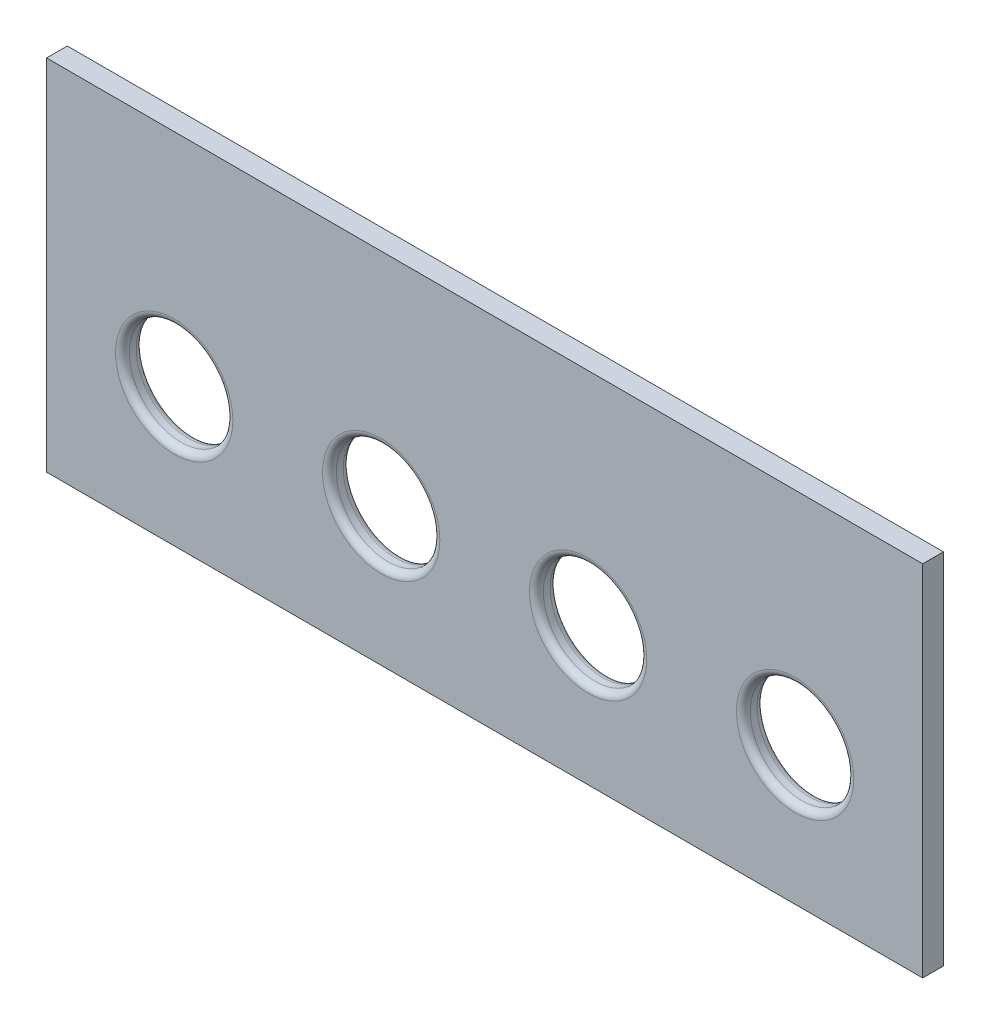
ISO-10303-21;
HEADER;
FILE_DESCRIPTION(('STEP AP214'),'2;1');
FILE_NAME('part.step','',(''),(''),'','','');
FILE_SCHEMA(('AUTOMOTIVE_DESIGN { 1 0 10303 214 1 1 1 1 }'));
ENDSEC;
DATA;
#1=APPLICATION_CONTEXT('core data for automotive mechanical design processes');
#2=APPLICATION_PROTOCOL_DEFINITION('international standard','automotive_design',2000,#1);
#3=PRODUCT_CONTEXT('',#1,'mechanical');
#4=PRODUCT('Part','Part','',(#3));
#5=PRODUCT_RELATED_PRODUCT_CATEGORY('part','',(#4));
#6=PRODUCT_DEFINITION_FORMATION('','',#4);
#7=PRODUCT_DEFINITION_CONTEXT('part definition',#1,'design');
#8=PRODUCT_DEFINITION('design','',#6,#7);
#9=PRODUCT_DEFINITION_SHAPE('','',#8);
#10=(LENGTH_UNIT() NAMED_UNIT(*) SI_UNIT(.MILLI.,.METRE.));
#11=(NAMED_UNIT(*) PLANE_ANGLE_UNIT() SI_UNIT($,.RADIAN.));
#12=(NAMED_UNIT(*) SI_UNIT($,.STERADIAN.) SOLID_ANGLE_UNIT());
#13=UNCERTAINTY_MEASURE_WITH_UNIT(LENGTH_MEASURE(1.E-05),#10,'distance_accuracy_value','');
#14=(GEOMETRIC_REPRESENTATION_CONTEXT(3) GLOBAL_UNCERTAINTY_ASSIGNED_CONTEXT((#13)) GLOBAL_UNIT_ASSIGNED_CONTEXT((#10,
#11,#12)) REPRESENTATION_CONTEXT('',''));
#15=CARTESIAN_POINT('',(0.,0.,0.));
#16=DIRECTION('',(0.,0.,1.));
#17=DIRECTION('',(1.,0.,0.));
#18=AXIS2_PLACEMENT_3D('',#15,#16,#17);
#19=CARTESIAN_POINT('',(0.,0.,3.));
#20=DIRECTION('',(1.,0.,0.));
#21=DIRECTION('',(0.,0.,-1.));
#22=AXIS2_PLACEMENT_3D('',#19,#20,#21);
#23=PLANE('',#22);
#24=DIRECTION('',(0.,-1.,0.));
#25=VECTOR('',#24,1.);
#26=CARTESIAN_POINT('',(0.,0.,0.));
#27=LINE('',#26,#25);
#28=CARTESIAN_POINT('',(0.,0.,0.));
#29=VERTEX_POINT('',#28);
#30=CARTESIAN_POINT('',(0.,-52.,0.));
#31=VERTEX_POINT('',#30);
#32=EDGE_CURVE('E101',#29,#31,#27,.T.);
#33=ORIENTED_EDGE('',*,*,#32,.T.);
#34=DIRECTION('',(0.,0.,-1.));
#35=VECTOR('',#34,1.);
#36=CARTESIAN_POINT('',(0.,-52.,3.));
#37=LINE('',#36,#35);
#38=CARTESIAN_POINT('',(0.,-52.,3.));
#39=VERTEX_POINT('',#38);
#40=EDGE_CURVE('E92',#39,#31,#37,.T.);
#41=ORIENTED_EDGE('',*,*,#40,.F.);
#42=DIRECTION('',(0.,-1.,0.));
#43=VECTOR('',#42,1.);
#44=CARTESIAN_POINT('',(0.,0.,3.));
#45=LINE('',#44,#43);
#46=CARTESIAN_POINT('',(0.,0.,3.));
#47=VERTEX_POINT('',#46);
#48=EDGE_CURVE('E86',#47,#39,#45,.T.);
#49=ORIENTED_EDGE('',*,*,#48,.F.);
#50=DIRECTION('',(0.,0.,-1.));
#51=VECTOR('',#50,1.);
#52=CARTESIAN_POINT('',(0.,0.,3.));
#53=LINE('',#52,#51);
#54=EDGE_CURVE('E97',#47,#29,#53,.T.);
#55=ORIENTED_EDGE('',*,*,#54,.T.);
#56=EDGE_LOOP('',(#33,#41,#49,#55));
#57=FACE_BOUND('',#56,.T.);
#58=ADVANCED_FACE('F33',(#57),#23,.F.);
#59=CARTESIAN_POINT('',(0.,-52.,3.));
#60=DIRECTION('',(0.,1.,0.));
#61=DIRECTION('',(0.,0.,1.));
#62=AXIS2_PLACEMENT_3D('',#59,#60,#61);
#63=PLANE('',#62);
#64=DIRECTION('',(1.,0.,0.));
#65=VECTOR('',#64,1.);
#66=CARTESIAN_POINT('',(0.,-52.,0.));
#67=LINE('',#66,#65);
#68=CARTESIAN_POINT('',(127.,-52.,0.));
#69=VERTEX_POINT('',#68);
#70=EDGE_CURVE('E91',#31,#69,#67,.T.);
#71=ORIENTED_EDGE('',*,*,#70,.T.);
#72=DIRECTION('',(0.,0.,-1.));
#73=VECTOR('',#72,1.);
#74=CARTESIAN_POINT('',(127.,-52.,3.));
#75=LINE('',#74,#73);
#76=CARTESIAN_POINT('',(127.,-52.,3.));
#77=VERTEX_POINT('',#76);
#78=EDGE_CURVE('E89',#77,#69,#75,.T.);
#79=ORIENTED_EDGE('',*,*,#78,.F.);
#80=DIRECTION('',(1.,0.,0.));
#81=VECTOR('',#80,1.);
#82=CARTESIAN_POINT('',(0.,-52.,3.));
#83=LINE('',#82,#81);
#84=EDGE_CURVE('E81',#39,#77,#83,.T.);
#85=ORIENTED_EDGE('',*,*,#84,.F.);
#86=ORIENTED_EDGE('',*,*,#40,.T.);
#87=EDGE_LOOP('',(#71,#79,#85,#86));
#88=FACE_BOUND('',#87,.T.);
#89=ADVANCED_FACE('F90',(#88),#63,.F.);
#90=CARTESIAN_POINT('',(127.,0.,3.));
#91=DIRECTION('',(-1.,0.,0.));
#92=DIRECTION('',(0.,0.,1.));
#93=AXIS2_PLACEMENT_3D('',#90,#91,#92);
#94=PLANE('',#93);
#95=DIRECTION('',(0.,1.,0.));
#96=VECTOR('',#95,1.);
#97=CARTESIAN_POINT('',(127.,0.,0.));
#98=LINE('',#97,#96);
#99=CARTESIAN_POINT('',(127.,0.,0.));
#100=VERTEX_POINT('',#99);
#101=EDGE_CURVE('E67',#69,#100,#98,.T.);
#102=ORIENTED_EDGE('',*,*,#101,.T.);
#103=DIRECTION('',(0.,0.,-1.));
#104=VECTOR('',#103,1.);
#105=CARTESIAN_POINT('',(127.,0.,3.));
#106=LINE('',#105,#104);
#107=CARTESIAN_POINT('',(127.,0.,3.));
#108=VERTEX_POINT('',#107);
#109=EDGE_CURVE('E93',#108,#100,#106,.T.);
#110=ORIENTED_EDGE('',*,*,#109,.F.);
#111=DIRECTION('',(0.,1.,0.));
#112=VECTOR('',#111,1.);
#113=CARTESIAN_POINT('',(127.,0.,3.));
#114=LINE('',#113,#112);
#115=EDGE_CURVE('E84',#77,#108,#114,.T.);
#116=ORIENTED_EDGE('',*,*,#115,.F.);
#117=ORIENTED_EDGE('',*,*,#78,.T.);
#118=EDGE_LOOP('',(#102,#110,#116,#117));
#119=FACE_BOUND('',#118,.T.);
#120=ADVANCED_FACE('F95',(#119),#94,.F.);
#121=CARTESIAN_POINT('',(0.,0.,3.));
#122=DIRECTION('',(0.,-1.,0.));
#123=DIRECTION('',(0.,0.,-1.));
#124=AXIS2_PLACEMENT_3D('',#121,#122,#123);
#125=PLANE('',#124);
#126=DIRECTION('',(-1.,0.,0.));
#127=VECTOR('',#126,1.);
#128=CARTESIAN_POINT('',(0.,0.,0.));
#129=LINE('',#128,#127);
#130=EDGE_CURVE('E73',#100,#29,#129,.T.);
#131=ORIENTED_EDGE('',*,*,#130,.T.);
#132=ORIENTED_EDGE('',*,*,#54,.F.);
#133=DIRECTION('',(-1.,0.,0.));
#134=VECTOR('',#133,1.);
#135=CARTESIAN_POINT('',(0.,0.,3.));
#136=LINE('',#135,#134);
#137=EDGE_CURVE('E50',#108,#47,#136,.T.);
#138=ORIENTED_EDGE('',*,*,#137,.F.);
#139=ORIENTED_EDGE('',*,*,#109,.T.);
#140=EDGE_LOOP('',(#131,#132,#138,#139));
#141=FACE_BOUND('',#140,.T.);
#142=ADVANCED_FACE('F223',(#141),#125,.F.);
#143=CARTESIAN_POINT('',(0.,0.,3.));
#144=DIRECTION('',(0.,0.,1.));
#145=DIRECTION('',(1.,0.,0.));
#146=AXIS2_PLACEMENT_3D('',#143,#144,#145);
#147=PLANE('',#146);
#148=CARTESIAN_POINT('',(108.5,-32.,3.));
#149=DIRECTION('',(0.,0.,1.));
#150=DIRECTION('',(1.,0.,0.));
#151=AXIS2_PLACEMENT_3D('',#148,#149,#150);
#152=CIRCLE('',#151,8.5);
#153=CARTESIAN_POINT('',(117.,-32.,3.));
#154=VERTEX_POINT('',#153);
#155=EDGE_CURVE('E137',#154,#154,#152,.F.);
#156=ORIENTED_EDGE('',*,*,#155,.T.);
#157=EDGE_LOOP('',(#156));
#158=FACE_BOUND('',#157,.T.);
#159=CARTESIAN_POINT('',(78.5,-32.,3.));
#160=DIRECTION('',(0.,0.,1.));
#161=DIRECTION('',(1.,0.,0.));
#162=AXIS2_PLACEMENT_3D('',#159,#160,#161);
#163=CIRCLE('',#162,8.5);
#164=CARTESIAN_POINT('',(87.,-32.,3.));
#165=VERTEX_POINT('',#164);
#166=EDGE_CURVE('E134',#165,#165,#163,.F.);
#167=ORIENTED_EDGE('',*,*,#166,.T.);
#168=EDGE_LOOP('',(#167));
#169=FACE_BOUND('',#168,.T.);
#170=CARTESIAN_POINT('',(48.5,-32.,3.));
#171=DIRECTION('',(0.,0.,1.));
#172=DIRECTION('',(1.,0.,0.));
#173=AXIS2_PLACEMENT_3D('',#170,#171,#172);
#174=CIRCLE('',#173,8.5);
#175=CARTESIAN_POINT('',(57.,-32.,3.));
#176=VERTEX_POINT('',#175);
#177=EDGE_CURVE('E131',#176,#176,#174,.F.);
#178=ORIENTED_EDGE('',*,*,#177,.T.);
#179=EDGE_LOOP('',(#178));
#180=FACE_BOUND('',#179,.T.);
#181=CARTESIAN_POINT('',(18.5,-32.,3.));
#182=DIRECTION('',(0.,0.,1.));
#183=DIRECTION('',(1.,0.,0.));
#184=AXIS2_PLACEMENT_3D('',#181,#182,#183);
#185=CIRCLE('',#184,8.5);
#186=CARTESIAN_POINT('',(27.,-32.,3.));
#187=VERTEX_POINT('',#186);
#188=EDGE_CURVE('E128',#187,#187,#185,.F.);
#189=ORIENTED_EDGE('',*,*,#188,.T.);
#190=EDGE_LOOP('',(#189));
#191=FACE_BOUND('',#190,.T.);
#192=ORIENTED_EDGE('',*,*,#48,.T.);
#193=ORIENTED_EDGE('',*,*,#84,.T.);
#194=ORIENTED_EDGE('',*,*,#115,.T.);
#195=ORIENTED_EDGE('',*,*,#137,.T.);
#196=EDGE_LOOP('',(#192,#193,#194,#195));
#197=FACE_BOUND('',#196,.T.);
#198=ADVANCED_FACE('F82',(#158,#169,#180,#191,#197),#147,.T.);
#199=CARTESIAN_POINT('',(0.,0.,0.));
#200=DIRECTION('',(0.,0.,1.));
#201=DIRECTION('',(1.,0.,0.));
#202=AXIS2_PLACEMENT_3D('',#199,#200,#201);
#203=PLANE('',#202);
#204=CARTESIAN_POINT('',(108.5,-32.,0.));
#205=DIRECTION('',(0.,0.,1.));
#206=DIRECTION('',(1.,0.,0.));
#207=AXIS2_PLACEMENT_3D('',#204,#205,#206);
#208=CIRCLE('',#207,8.5);
#209=CARTESIAN_POINT('',(117.,-32.,0.));
#210=VERTEX_POINT('',#209);
#211=EDGE_CURVE('E119',#210,#210,#208,.T.);
#212=ORIENTED_EDGE('',*,*,#211,.T.);
#213=EDGE_LOOP('',(#212));
#214=FACE_BOUND('',#213,.T.);
#215=CARTESIAN_POINT('',(78.5,-32.,0.));
#216=DIRECTION('',(0.,0.,1.));
#217=DIRECTION('',(1.,0.,0.));
#218=AXIS2_PLACEMENT_3D('',#215,#216,#217);
#219=CIRCLE('',#218,8.5);
#220=CARTESIAN_POINT('',(87.,-32.,0.));
#221=VERTEX_POINT('',#220);
#222=EDGE_CURVE('E116',#221,#221,#219,.T.);
#223=ORIENTED_EDGE('',*,*,#222,.T.);
#224=EDGE_LOOP('',(#223));
#225=FACE_BOUND('',#224,.T.);
#226=CARTESIAN_POINT('',(48.5,-32.,0.));
#227=DIRECTION('',(0.,0.,1.));
#228=DIRECTION('',(1.,0.,0.));
#229=AXIS2_PLACEMENT_3D('',#226,#227,#228);
#230=CIRCLE('',#229,8.5);
#231=CARTESIAN_POINT('',(57.,-32.,0.));
#232=VERTEX_POINT('',#231);
#233=EDGE_CURVE('E113',#232,#232,#230,.T.);
#234=ORIENTED_EDGE('',*,*,#233,.T.);
#235=EDGE_LOOP('',(#234));
#236=FACE_BOUND('',#235,.T.);
#237=CARTESIAN_POINT('',(18.5,-32.,0.));
#238=DIRECTION('',(0.,0.,1.));
#239=DIRECTION('',(1.,0.,0.));
#240=AXIS2_PLACEMENT_3D('',#237,#238,#239);
#241=CIRCLE('',#240,8.5);
#242=CARTESIAN_POINT('',(27.,-32.,0.));
#243=VERTEX_POINT('',#242);
#244=EDGE_CURVE('E110',#243,#243,#241,.T.);
#245=ORIENTED_EDGE('',*,*,#244,.T.);
#246=EDGE_LOOP('',(#245));
#247=FACE_BOUND('',#246,.T.);
#248=ORIENTED_EDGE('',*,*,#32,.F.);
#249=ORIENTED_EDGE('',*,*,#130,.F.);
#250=ORIENTED_EDGE('',*,*,#101,.F.);
#251=ORIENTED_EDGE('',*,*,#70,.F.);
#252=EDGE_LOOP('',(#248,#249,#250,#251));
#253=FACE_BOUND('',#252,.T.);
#254=ADVANCED_FACE('F219',(#214,#225,#236,#247,#253),#203,.F.);
#255=CARTESIAN_POINT('',(78.5,-32.,0.));
#256=DIRECTION('',(0.,0.,1.));
#257=DIRECTION('',(1.,0.,0.));
#258=AXIS2_PLACEMENT_3D('',#255,#256,#257);
#259=CYLINDRICAL_SURFACE('',#258,7.5);
#260=CARTESIAN_POINT('',(78.5,-32.,1.));
#261=DIRECTION('',(0.,0.,1.));
#262=DIRECTION('',(1.,0.,0.));
#263=AXIS2_PLACEMENT_3D('',#260,#261,#262);
#264=CIRCLE('',#263,7.5);
#265=CARTESIAN_POINT('',(86.,-32.,1.));
#266=VERTEX_POINT('',#265);
#267=EDGE_CURVE('E143',#266,#266,#264,.F.);
#268=ORIENTED_EDGE('',*,*,#267,.T.);
#269=EDGE_LOOP('',(#268));
#270=FACE_BOUND('',#269,.T.);
#271=CARTESIAN_POINT('',(78.5,-32.,2.));
#272=DIRECTION('',(0.,0.,1.));
#273=DIRECTION('',(1.,0.,0.));
#274=AXIS2_PLACEMENT_3D('',#271,#272,#273);
#275=CIRCLE('',#274,7.5);
#276=CARTESIAN_POINT('',(86.,-32.,2.));
#277=VERTEX_POINT('',#276);
#278=EDGE_CURVE('E140',#277,#277,#275,.T.);
#279=ORIENTED_EDGE('',*,*,#278,.T.);
#280=EDGE_LOOP('',(#279));
#281=FACE_BOUND('',#280,.T.);
#282=ADVANCED_FACE('F213',(#270,#281),#259,.F.);
#283=CARTESIAN_POINT('',(108.5,-32.,0.));
#284=DIRECTION('',(0.,0.,1.));
#285=DIRECTION('',(1.,0.,0.));
#286=AXIS2_PLACEMENT_3D('',#283,#284,#285);
#287=CYLINDRICAL_SURFACE('',#286,7.5);
#288=CARTESIAN_POINT('',(108.5,-32.,1.));
#289=DIRECTION('',(0.,0.,1.));
#290=DIRECTION('',(1.,0.,0.));
#291=AXIS2_PLACEMENT_3D('',#288,#289,#290);
#292=CIRCLE('',#291,7.5);
#293=CARTESIAN_POINT('',(116.,-32.,1.));
#294=VERTEX_POINT('',#293);
#295=EDGE_CURVE('E125',#294,#294,#292,.F.);
#296=ORIENTED_EDGE('',*,*,#295,.T.);
#297=EDGE_LOOP('',(#296));
#298=FACE_BOUND('',#297,.T.);
#299=CARTESIAN_POINT('',(108.5,-32.,2.));
#300=DIRECTION('',(0.,0.,1.));
#301=DIRECTION('',(1.,0.,0.));
#302=AXIS2_PLACEMENT_3D('',#299,#300,#301);
#303=CIRCLE('',#302,7.5);
#304=CARTESIAN_POINT('',(116.,-32.,2.));
#305=VERTEX_POINT('',#304);
#306=EDGE_CURVE('E122',#305,#305,#303,.T.);
#307=ORIENTED_EDGE('',*,*,#306,.T.);
#308=EDGE_LOOP('',(#307));
#309=FACE_BOUND('',#308,.T.);
#310=ADVANCED_FACE('F204',(#298,#309),#287,.F.);
#311=CARTESIAN_POINT('',(48.5,-32.,0.));
#312=DIRECTION('',(0.,0.,1.));
#313=DIRECTION('',(1.,0.,0.));
#314=AXIS2_PLACEMENT_3D('',#311,#312,#313);
#315=CYLINDRICAL_SURFACE('',#314,7.5);
#316=CARTESIAN_POINT('',(48.5,-32.,1.));
#317=DIRECTION('',(0.,0.,1.));
#318=DIRECTION('',(1.,0.,0.));
#319=AXIS2_PLACEMENT_3D('',#316,#317,#318);
#320=CIRCLE('',#319,7.5);
#321=CARTESIAN_POINT('',(56.,-32.,1.));
#322=VERTEX_POINT('',#321);
#323=EDGE_CURVE('E149',#322,#322,#320,.F.);
#324=ORIENTED_EDGE('',*,*,#323,.T.);
#325=EDGE_LOOP('',(#324));
#326=FACE_BOUND('',#325,.T.);
#327=CARTESIAN_POINT('',(48.5,-32.,2.));
#328=DIRECTION('',(0.,0.,1.));
#329=DIRECTION('',(1.,0.,0.));
#330=AXIS2_PLACEMENT_3D('',#327,#328,#329);
#331=CIRCLE('',#330,7.5);
#332=CARTESIAN_POINT('',(56.,-32.,2.));
#333=VERTEX_POINT('',#332);
#334=EDGE_CURVE('E146',#333,#333,#331,.T.);
#335=ORIENTED_EDGE('',*,*,#334,.T.);
#336=EDGE_LOOP('',(#335));
#337=FACE_BOUND('',#336,.T.);
#338=ADVANCED_FACE('F202',(#326,#337),#315,.F.);
#339=CARTESIAN_POINT('',(18.5,-32.,0.));
#340=DIRECTION('',(0.,0.,1.));
#341=DIRECTION('',(1.,0.,0.));
#342=AXIS2_PLACEMENT_3D('',#339,#340,#341);
#343=CYLINDRICAL_SURFACE('',#342,7.5);
#344=CARTESIAN_POINT('',(18.5,-32.,1.));
#345=DIRECTION('',(0.,0.,1.));
#346=DIRECTION('',(1.,0.,0.));
#347=AXIS2_PLACEMENT_3D('',#344,#345,#346);
#348=CIRCLE('',#347,7.5);
#349=CARTESIAN_POINT('',(26.,-32.,1.));
#350=VERTEX_POINT('',#349);
#351=EDGE_CURVE('E11',#350,#350,#348,.F.);
#352=ORIENTED_EDGE('',*,*,#351,.T.);
#353=EDGE_LOOP('',(#352));
#354=FACE_BOUND('',#353,.T.);
#355=CARTESIAN_POINT('',(18.5,-32.,2.));
#356=DIRECTION('',(0.,0.,1.));
#357=DIRECTION('',(1.,0.,0.));
#358=AXIS2_PLACEMENT_3D('',#355,#356,#357);
#359=CIRCLE('',#358,7.5);
#360=CARTESIAN_POINT('',(26.,-32.,2.));
#361=VERTEX_POINT('',#360);
#362=EDGE_CURVE('E42',#361,#361,#359,.T.);
#363=ORIENTED_EDGE('',*,*,#362,.T.);
#364=EDGE_LOOP('',(#363));
#365=FACE_BOUND('',#364,.T.);
#366=ADVANCED_FACE('F154',(#354,#365),#343,.F.);
#367=CARTESIAN_POINT('',(108.5,-32.,1.));
#368=DIRECTION('',(0.,0.,1.));
#369=DIRECTION('',(1.,0.,0.));
#370=AXIS2_PLACEMENT_3D('',#367,#368,#369);
#371=TOROIDAL_SURFACE('',#370,8.5,1.);
#372=ORIENTED_EDGE('',*,*,#295,.F.);
#373=EDGE_LOOP('',(#372));
#374=FACE_BOUND('',#373,.T.);
#375=ORIENTED_EDGE('',*,*,#211,.F.);
#376=EDGE_LOOP('',(#375));
#377=FACE_BOUND('',#376,.T.);
#378=ADVANCED_FACE('F174',(#374,#377),#371,.T.);
#379=CARTESIAN_POINT('',(108.5,-32.,2.));
#380=DIRECTION('',(0.,0.,1.));
#381=DIRECTION('',(1.,0.,0.));
#382=AXIS2_PLACEMENT_3D('',#379,#380,#381);
#383=TOROIDAL_SURFACE('',#382,8.5,1.);
#384=ORIENTED_EDGE('',*,*,#155,.F.);
#385=EDGE_LOOP('',(#384));
#386=FACE_BOUND('',#385,.T.);
#387=ORIENTED_EDGE('',*,*,#306,.F.);
#388=EDGE_LOOP('',(#387));
#389=FACE_BOUND('',#388,.T.);
#390=ADVANCED_FACE('F177',(#386,#389),#383,.T.);
#391=CARTESIAN_POINT('',(78.5,-32.,1.));
#392=DIRECTION('',(0.,0.,1.));
#393=DIRECTION('',(1.,0.,0.));
#394=AXIS2_PLACEMENT_3D('',#391,#392,#393);
#395=TOROIDAL_SURFACE('',#394,8.5,1.);
#396=ORIENTED_EDGE('',*,*,#267,.F.);
#397=EDGE_LOOP('',(#396));
#398=FACE_BOUND('',#397,.T.);
#399=ORIENTED_EDGE('',*,*,#222,.F.);
#400=EDGE_LOOP('',(#399));
#401=FACE_BOUND('',#400,.T.);
#402=ADVANCED_FACE('F181',(#398,#401),#395,.T.);
#403=CARTESIAN_POINT('',(78.5,-32.,2.));
#404=DIRECTION('',(0.,0.,1.));
#405=DIRECTION('',(1.,0.,0.));
#406=AXIS2_PLACEMENT_3D('',#403,#404,#405);
#407=TOROIDAL_SURFACE('',#406,8.5,1.);
#408=ORIENTED_EDGE('',*,*,#166,.F.);
#409=EDGE_LOOP('',(#408));
#410=FACE_BOUND('',#409,.T.);
#411=ORIENTED_EDGE('',*,*,#278,.F.);
#412=EDGE_LOOP('',(#411));
#413=FACE_BOUND('',#412,.T.);
#414=ADVANCED_FACE('F185',(#410,#413),#407,.T.);
#415=CARTESIAN_POINT('',(48.5,-32.,1.));
#416=DIRECTION('',(0.,0.,1.));
#417=DIRECTION('',(1.,0.,0.));
#418=AXIS2_PLACEMENT_3D('',#415,#416,#417);
#419=TOROIDAL_SURFACE('',#418,8.5,1.);
#420=ORIENTED_EDGE('',*,*,#323,.F.);
#421=EDGE_LOOP('',(#420));
#422=FACE_BOUND('',#421,.T.);
#423=ORIENTED_EDGE('',*,*,#233,.F.);
#424=EDGE_LOOP('',(#423));
#425=FACE_BOUND('',#424,.T.);
#426=ADVANCED_FACE('F189',(#422,#425),#419,.T.);
#427=CARTESIAN_POINT('',(48.5,-32.,2.));
#428=DIRECTION('',(0.,0.,1.));
#429=DIRECTION('',(1.,0.,0.));
#430=AXIS2_PLACEMENT_3D('',#427,#428,#429);
#431=TOROIDAL_SURFACE('',#430,8.5,1.);
#432=ORIENTED_EDGE('',*,*,#177,.F.);
#433=EDGE_LOOP('',(#432));
#434=FACE_BOUND('',#433,.T.);
#435=ORIENTED_EDGE('',*,*,#334,.F.);
#436=EDGE_LOOP('',(#435));
#437=FACE_BOUND('',#436,.T.);
#438=ADVANCED_FACE('F162',(#434,#437),#431,.T.);
#439=CARTESIAN_POINT('',(18.5,-32.,1.));
#440=DIRECTION('',(0.,0.,1.));
#441=DIRECTION('',(1.,0.,0.));
#442=AXIS2_PLACEMENT_3D('',#439,#440,#441);
#443=TOROIDAL_SURFACE('',#442,8.5,1.);
#444=ORIENTED_EDGE('',*,*,#351,.F.);
#445=EDGE_LOOP('',(#444));
#446=FACE_BOUND('',#445,.T.);
#447=ORIENTED_EDGE('',*,*,#244,.F.);
#448=EDGE_LOOP('',(#447));
#449=FACE_BOUND('',#448,.T.);
#450=ADVANCED_FACE('F157',(#446,#449),#443,.T.);
#451=CARTESIAN_POINT('',(18.5,-32.,2.));
#452=DIRECTION('',(0.,0.,1.));
#453=DIRECTION('',(1.,0.,0.));
#454=AXIS2_PLACEMENT_3D('',#451,#452,#453);
#455=TOROIDAL_SURFACE('',#454,8.5,1.);
#456=ORIENTED_EDGE('',*,*,#188,.F.);
#457=EDGE_LOOP('',(#456));
#458=FACE_BOUND('',#457,.T.);
#459=ORIENTED_EDGE('',*,*,#362,.F.);
#460=EDGE_LOOP('',(#459));
#461=FACE_BOUND('',#460,.T.);
#462=ADVANCED_FACE('F35',(#458,#461),#455,.T.);
#463=CLOSED_SHELL('',(#58,#89,#120,#142,#198,#254,#282,#310,#338,#366,#378,#390,#402,#414,#426,
#438,#450,#462));
#464=MANIFOLD_SOLID_BREP('B2',#463);
#465=ADVANCED_BREP_SHAPE_REPRESENTATION('',(#18,#464),#14);
#466=SHAPE_DEFINITION_REPRESENTATION(#9,#465);
ENDSEC;
END-ISO-10303-21;
